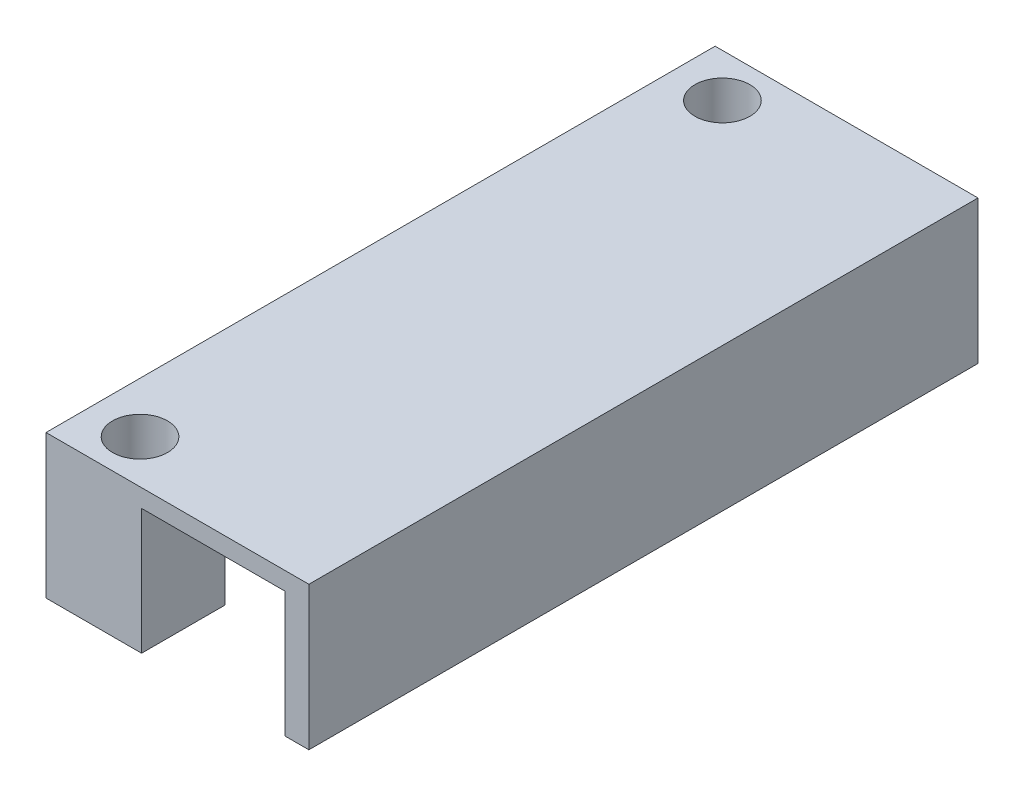
ISO-10303-21;
HEADER;
FILE_DESCRIPTION(('STEP AP214'),'2;1');
FILE_NAME('part.step','',(''),(''),'','','');
FILE_SCHEMA(('AUTOMOTIVE_DESIGN { 1 0 10303 214 1 1 1 1 }'));
ENDSEC;
DATA;
#1=APPLICATION_CONTEXT('core data for automotive mechanical design processes');
#2=APPLICATION_PROTOCOL_DEFINITION('international standard','automotive_design',2000,#1);
#3=PRODUCT_CONTEXT('',#1,'mechanical');
#4=PRODUCT('Part','Part','',(#3));
#5=PRODUCT_RELATED_PRODUCT_CATEGORY('part','',(#4));
#6=PRODUCT_DEFINITION_FORMATION('','',#4);
#7=PRODUCT_DEFINITION_CONTEXT('part definition',#1,'design');
#8=PRODUCT_DEFINITION('design','',#6,#7);
#9=PRODUCT_DEFINITION_SHAPE('','',#8);
#10=(LENGTH_UNIT() NAMED_UNIT(*) SI_UNIT(.MILLI.,.METRE.));
#11=(NAMED_UNIT(*) PLANE_ANGLE_UNIT() SI_UNIT($,.RADIAN.));
#12=(NAMED_UNIT(*) SI_UNIT($,.STERADIAN.) SOLID_ANGLE_UNIT());
#13=UNCERTAINTY_MEASURE_WITH_UNIT(LENGTH_MEASURE(1.E-05),#10,'distance_accuracy_value','');
#14=(GEOMETRIC_REPRESENTATION_CONTEXT(3) GLOBAL_UNCERTAINTY_ASSIGNED_CONTEXT((#13)) GLOBAL_UNIT_ASSIGNED_CONTEXT((#10,
#11,#12)) REPRESENTATION_CONTEXT('',''));
#15=CARTESIAN_POINT('',(0.,0.,0.));
#16=DIRECTION('',(0.,0.,1.));
#17=DIRECTION('',(1.,0.,0.));
#18=AXIS2_PLACEMENT_3D('',#15,#16,#17);
#19=CARTESIAN_POINT('',(0.,0.,0.));
#20=DIRECTION('',(0.,1.,0.));
#21=DIRECTION('',(0.,0.,1.));
#22=AXIS2_PLACEMENT_3D('',#19,#20,#21);
#23=PLANE('',#22);
#24=DIRECTION('',(0.,0.,1.));
#25=VECTOR('',#24,1.);
#26=CARTESIAN_POINT('',(10.,0.,27.));
#27=LINE('',#26,#25);
#28=CARTESIAN_POINT('',(10.,0.,-28.));
#29=VERTEX_POINT('',#28);
#30=CARTESIAN_POINT('',(10.,0.,28.));
#31=VERTEX_POINT('',#30);
#32=EDGE_CURVE('E200',#29,#31,#27,.T.);
#33=ORIENTED_EDGE('',*,*,#32,.F.);
#34=DIRECTION('',(1.,0.,0.));
#35=VECTOR('',#34,1.);
#36=CARTESIAN_POINT('',(0.,0.,-28.));
#37=LINE('',#36,#35);
#38=CARTESIAN_POINT('',(12.,0.,-28.));
#39=VERTEX_POINT('',#38);
#40=EDGE_CURVE('E158',#29,#39,#37,.T.);
#41=ORIENTED_EDGE('',*,*,#40,.T.);
#42=DIRECTION('',(0.,0.,1.));
#43=VECTOR('',#42,1.);
#44=CARTESIAN_POINT('',(12.,0.,0.));
#45=LINE('',#44,#43);
#46=CARTESIAN_POINT('',(12.,0.,28.));
#47=VERTEX_POINT('',#46);
#48=EDGE_CURVE('E245',#39,#47,#45,.T.);
#49=ORIENTED_EDGE('',*,*,#48,.T.);
#50=DIRECTION('',(-1.,0.,0.));
#51=VECTOR('',#50,1.);
#52=CARTESIAN_POINT('',(0.,0.,28.));
#53=LINE('',#52,#51);
#54=EDGE_CURVE('E196',#47,#31,#53,.T.);
#55=ORIENTED_EDGE('',*,*,#54,.T.);
#56=EDGE_LOOP('',(#33,#41,#49,#55));
#57=FACE_BOUND('',#56,.T.);
#58=ADVANCED_FACE('F47',(#57),#23,.F.);
#59=CARTESIAN_POINT('',(-5.76,0.,24.37));
#60=DIRECTION('',(0.,1.,0.));
#61=DIRECTION('',(0.,0.,1.));
#62=AXIS2_PLACEMENT_3D('',#59,#60,#61);
#63=CIRCLE('',#62,2.3);
#64=CARTESIAN_POINT('',(-5.76,0.,26.67));
#65=VERTEX_POINT('',#64);
#66=EDGE_CURVE('E51',#65,#65,#63,.F.);
#67=ORIENTED_EDGE('',*,*,#66,.F.);
#68=EDGE_LOOP('',(#67));
#69=FACE_BOUND('',#68,.T.);
#70=DIRECTION('',(0.,0.,-1.));
#71=VECTOR('',#70,1.);
#72=CARTESIAN_POINT('',(-2.,0.,27.));
#73=LINE('',#72,#71);
#74=CARTESIAN_POINT('',(-2.,0.,28.));
#75=VERTEX_POINT('',#74);
#76=CARTESIAN_POINT('',(-2.,0.,21.));
#77=VERTEX_POINT('',#76);
#78=EDGE_CURVE('E229',#75,#77,#73,.T.);
#79=ORIENTED_EDGE('',*,*,#78,.F.);
#80=CARTESIAN_POINT('',(-10.,0.,28.));
#81=VERTEX_POINT('',#80);
#82=EDGE_CURVE('E201',#75,#81,#53,.T.);
#83=ORIENTED_EDGE('',*,*,#82,.T.);
#84=DIRECTION('',(0.,0.,-1.));
#85=VECTOR('',#84,1.);
#86=CARTESIAN_POINT('',(-10.,0.,0.));
#87=LINE('',#86,#85);
#88=CARTESIAN_POINT('',(-10.,0.,21.));
#89=VERTEX_POINT('',#88);
#90=EDGE_CURVE('E267',#81,#89,#87,.T.);
#91=ORIENTED_EDGE('',*,*,#90,.T.);
#92=DIRECTION('',(-1.,0.,0.));
#93=VECTOR('',#92,1.);
#94=CARTESIAN_POINT('',(-2.,0.,21.));
#95=LINE('',#94,#93);
#96=EDGE_CURVE('E233',#77,#89,#95,.T.);
#97=ORIENTED_EDGE('',*,*,#96,.F.);
#98=EDGE_LOOP('',(#79,#83,#91,#97));
#99=FACE_BOUND('',#98,.T.);
#100=ADVANCED_FACE('F281',(#69,#99),#23,.F.);
#101=CARTESIAN_POINT('',(-5.76,0.,-24.37));
#102=DIRECTION('',(0.,1.,0.));
#103=DIRECTION('',(0.,0.,1.));
#104=AXIS2_PLACEMENT_3D('',#101,#102,#103);
#105=CIRCLE('',#104,2.3);
#106=CARTESIAN_POINT('',(-5.76,0.,-22.07));
#107=VERTEX_POINT('',#106);
#108=EDGE_CURVE('E270',#107,#107,#105,.T.);
#109=ORIENTED_EDGE('',*,*,#108,.T.);
#110=EDGE_LOOP('',(#109));
#111=FACE_BOUND('',#110,.T.);
#112=CARTESIAN_POINT('',(-10.,0.,-28.));
#113=VERTEX_POINT('',#112);
#114=CARTESIAN_POINT('',(-2.,0.,-28.));
#115=VERTEX_POINT('',#114);
#116=EDGE_CURVE('E189',#113,#115,#37,.T.);
#117=ORIENTED_EDGE('',*,*,#116,.T.);
#118=DIRECTION('',(0.,0.,-1.));
#119=VECTOR('',#118,1.);
#120=CARTESIAN_POINT('',(-1.99999999999999,0.,-21.));
#121=LINE('',#120,#119);
#122=CARTESIAN_POINT('',(-1.99999999999999,0.,-21.));
#123=VERTEX_POINT('',#122);
#124=EDGE_CURVE('E73',#123,#115,#121,.T.);
#125=ORIENTED_EDGE('',*,*,#124,.F.);
#126=DIRECTION('',(1.,0.,0.));
#127=VECTOR('',#126,1.);
#128=CARTESIAN_POINT('',(-1.99999999999999,0.,-21.));
#129=LINE('',#128,#127);
#130=CARTESIAN_POINT('',(-9.99999999999999,0.,-21.));
#131=VERTEX_POINT('',#130);
#132=EDGE_CURVE('E236',#131,#123,#129,.T.);
#133=ORIENTED_EDGE('',*,*,#132,.F.);
#134=EDGE_CURVE('E266',#131,#113,#87,.T.);
#135=ORIENTED_EDGE('',*,*,#134,.T.);
#136=EDGE_LOOP('',(#117,#125,#133,#135));
#137=FACE_BOUND('',#136,.T.);
#138=ADVANCED_FACE('F284',(#111,#137),#23,.F.);
#139=CARTESIAN_POINT('',(0.,-22.0227155455452,28.));
#140=DIRECTION('',(0.,0.,1.));
#141=DIRECTION('',(1.,0.,0.));
#142=AXIS2_PLACEMENT_3D('',#139,#140,#141);
#143=PLANE('',#142);
#144=DIRECTION('',(-1.,0.,0.));
#145=VECTOR('',#144,1.);
#146=CARTESIAN_POINT('',(0.,10.5,28.));
#147=LINE('',#146,#145);
#148=CARTESIAN_POINT('',(10.,10.5,28.));
#149=VERTEX_POINT('',#148);
#150=CARTESIAN_POINT('',(-2.,10.5,28.));
#151=VERTEX_POINT('',#150);
#152=EDGE_CURVE('E165',#149,#151,#147,.T.);
#153=ORIENTED_EDGE('',*,*,#152,.F.);
#154=DIRECTION('',(0.,1.,0.));
#155=VECTOR('',#154,1.);
#156=CARTESIAN_POINT('',(10.,-57.2712842531054,28.));
#157=LINE('',#156,#155);
#158=EDGE_CURVE('E174',#31,#149,#157,.T.);
#159=ORIENTED_EDGE('',*,*,#158,.F.);
#160=ORIENTED_EDGE('',*,*,#54,.F.);
#161=DIRECTION('',(0.,1.,0.));
#162=VECTOR('',#161,1.);
#163=CARTESIAN_POINT('',(12.,-22.0227155455452,28.));
#164=LINE('',#163,#162);
#165=CARTESIAN_POINT('',(12.,12.,28.));
#166=VERTEX_POINT('',#165);
#167=EDGE_CURVE('E206',#47,#166,#164,.T.);
#168=ORIENTED_EDGE('',*,*,#167,.T.);
#169=DIRECTION('',(1.,0.,0.));
#170=VECTOR('',#169,1.);
#171=CARTESIAN_POINT('',(0.,12.,28.));
#172=LINE('',#171,#170);
#173=CARTESIAN_POINT('',(-10.,12.,28.));
#174=VERTEX_POINT('',#173);
#175=EDGE_CURVE('E193',#174,#166,#172,.T.);
#176=ORIENTED_EDGE('',*,*,#175,.F.);
#177=DIRECTION('',(0.,1.,0.));
#178=VECTOR('',#177,1.);
#179=CARTESIAN_POINT('',(-10.,-22.0227155455452,28.));
#180=LINE('',#179,#178);
#181=EDGE_CURVE('E205',#81,#174,#180,.T.);
#182=ORIENTED_EDGE('',*,*,#181,.F.);
#183=ORIENTED_EDGE('',*,*,#82,.F.);
#184=DIRECTION('',(0.,1.,0.));
#185=VECTOR('',#184,1.);
#186=CARTESIAN_POINT('',(-2.,-57.2712842531054,28.));
#187=LINE('',#186,#185);
#188=EDGE_CURVE('E168',#75,#151,#187,.T.);
#189=ORIENTED_EDGE('',*,*,#188,.T.);
#190=EDGE_LOOP('',(#153,#159,#160,#168,#176,#182,#183,#189));
#191=FACE_BOUND('',#190,.T.);
#192=ADVANCED_FACE('F293',(#191),#143,.T.);
#193=CARTESIAN_POINT('',(0.,-22.0227155455452,-28.));
#194=DIRECTION('',(0.,0.,-1.));
#195=DIRECTION('',(-1.,0.,0.));
#196=AXIS2_PLACEMENT_3D('',#193,#194,#195);
#197=PLANE('',#196);
#198=ORIENTED_EDGE('',*,*,#40,.F.);
#199=DIRECTION('',(0.,1.,0.));
#200=VECTOR('',#199,1.);
#201=CARTESIAN_POINT('',(10.,-57.2712842531054,-28.));
#202=LINE('',#201,#200);
#203=CARTESIAN_POINT('',(10.,10.5,-28.));
#204=VERTEX_POINT('',#203);
#205=EDGE_CURVE('E159',#29,#204,#202,.T.);
#206=ORIENTED_EDGE('',*,*,#205,.T.);
#207=DIRECTION('',(1.,0.,0.));
#208=VECTOR('',#207,1.);
#209=CARTESIAN_POINT('',(0.,10.5,-28.));
#210=LINE('',#209,#208);
#211=CARTESIAN_POINT('',(-2.,10.5,-28.));
#212=VERTEX_POINT('',#211);
#213=EDGE_CURVE('E145',#212,#204,#210,.T.);
#214=ORIENTED_EDGE('',*,*,#213,.F.);
#215=DIRECTION('',(0.,1.,0.));
#216=VECTOR('',#215,1.);
#217=CARTESIAN_POINT('',(-2.,-57.2712842531054,-28.));
#218=LINE('',#217,#216);
#219=EDGE_CURVE('E152',#115,#212,#218,.T.);
#220=ORIENTED_EDGE('',*,*,#219,.F.);
#221=ORIENTED_EDGE('',*,*,#116,.F.);
#222=DIRECTION('',(0.,1.,0.));
#223=VECTOR('',#222,1.);
#224=CARTESIAN_POINT('',(-10.,-22.0227155455452,-28.));
#225=LINE('',#224,#223);
#226=CARTESIAN_POINT('',(-10.,12.,-28.));
#227=VERTEX_POINT('',#226);
#228=EDGE_CURVE('E180',#113,#227,#225,.T.);
#229=ORIENTED_EDGE('',*,*,#228,.T.);
#230=DIRECTION('',(-1.,0.,0.));
#231=VECTOR('',#230,1.);
#232=CARTESIAN_POINT('',(0.,12.,-28.));
#233=LINE('',#232,#231);
#234=CARTESIAN_POINT('',(12.,12.,-28.));
#235=VERTEX_POINT('',#234);
#236=EDGE_CURVE('E184',#235,#227,#233,.T.);
#237=ORIENTED_EDGE('',*,*,#236,.F.);
#238=DIRECTION('',(0.,1.,0.));
#239=VECTOR('',#238,1.);
#240=CARTESIAN_POINT('',(12.,-22.0227155455452,-28.));
#241=LINE('',#240,#239);
#242=EDGE_CURVE('E185',#39,#235,#241,.T.);
#243=ORIENTED_EDGE('',*,*,#242,.F.);
#244=EDGE_LOOP('',(#198,#206,#214,#220,#221,#229,#237,#243));
#245=FACE_BOUND('',#244,.T.);
#246=ADVANCED_FACE('F162',(#245),#197,.T.);
#247=CARTESIAN_POINT('',(12.,12.,0.));
#248=DIRECTION('',(1.,0.,0.));
#249=DIRECTION('',(0.,0.,-1.));
#250=AXIS2_PLACEMENT_3D('',#247,#248,#249);
#251=PLANE('',#250);
#252=ORIENTED_EDGE('',*,*,#48,.F.);
#253=ORIENTED_EDGE('',*,*,#242,.T.);
#254=DIRECTION('',(0.,0.,1.));
#255=VECTOR('',#254,1.);
#256=CARTESIAN_POINT('',(12.,12.,0.));
#257=LINE('',#256,#255);
#258=EDGE_CURVE('E255',#235,#166,#257,.T.);
#259=ORIENTED_EDGE('',*,*,#258,.T.);
#260=ORIENTED_EDGE('',*,*,#167,.F.);
#261=EDGE_LOOP('',(#252,#253,#259,#260));
#262=FACE_BOUND('',#261,.T.);
#263=ADVANCED_FACE('F49',(#262),#251,.T.);
#264=CARTESIAN_POINT('',(-10.,12.,0.));
#265=DIRECTION('',(-1.,0.,0.));
#266=DIRECTION('',(0.,0.,1.));
#267=AXIS2_PLACEMENT_3D('',#264,#265,#266);
#268=PLANE('',#267);
#269=DIRECTION('',(0.,-1.,0.));
#270=VECTOR('',#269,1.);
#271=CARTESIAN_POINT('',(-9.99999999999999,10.5,-21.));
#272=LINE('',#271,#270);
#273=CARTESIAN_POINT('',(-9.99999999999999,10.5,-21.));
#274=VERTEX_POINT('',#273);
#275=EDGE_CURVE('E246',#274,#131,#272,.T.);
#276=ORIENTED_EDGE('',*,*,#275,.F.);
#277=DIRECTION('',(0.,0.,-1.));
#278=VECTOR('',#277,1.);
#279=CARTESIAN_POINT('',(-10.,10.5,21.));
#280=LINE('',#279,#278);
#281=CARTESIAN_POINT('',(-10.,10.5,21.));
#282=VERTEX_POINT('',#281);
#283=EDGE_CURVE('E222',#282,#274,#280,.T.);
#284=ORIENTED_EDGE('',*,*,#283,.F.);
#285=DIRECTION('',(0.,-1.,0.));
#286=VECTOR('',#285,1.);
#287=CARTESIAN_POINT('',(-10.,10.5,21.));
#288=LINE('',#287,#286);
#289=EDGE_CURVE('E249',#282,#89,#288,.T.);
#290=ORIENTED_EDGE('',*,*,#289,.T.);
#291=ORIENTED_EDGE('',*,*,#90,.F.);
#292=ORIENTED_EDGE('',*,*,#181,.T.);
#293=DIRECTION('',(0.,0.,-1.));
#294=VECTOR('',#293,1.);
#295=CARTESIAN_POINT('',(-10.,12.,0.));
#296=LINE('',#295,#294);
#297=EDGE_CURVE('E258',#174,#227,#296,.T.);
#298=ORIENTED_EDGE('',*,*,#297,.T.);
#299=ORIENTED_EDGE('',*,*,#228,.F.);
#300=ORIENTED_EDGE('',*,*,#134,.F.);
#301=EDGE_LOOP('',(#276,#284,#290,#291,#292,#298,#299,#300));
#302=FACE_BOUND('',#301,.T.);
#303=ADVANCED_FACE('F316',(#302),#268,.T.);
#304=CARTESIAN_POINT('',(-5.76,12.,-24.37));
#305=DIRECTION('',(0.,-1.,0.));
#306=DIRECTION('',(0.,0.,-1.));
#307=AXIS2_PLACEMENT_3D('',#304,#305,#306);
#308=CYLINDRICAL_SURFACE('',#307,2.3);
#309=CARTESIAN_POINT('',(-5.76,12.,-24.37));
#310=DIRECTION('',(0.,1.,0.));
#311=DIRECTION('',(0.,0.,1.));
#312=AXIS2_PLACEMENT_3D('',#309,#310,#311);
#313=CIRCLE('',#312,2.3);
#314=CARTESIAN_POINT('',(-5.76,12.,-22.07));
#315=VERTEX_POINT('',#314);
#316=EDGE_CURVE('E57',#315,#315,#313,.T.);
#317=ORIENTED_EDGE('',*,*,#316,.T.);
#318=EDGE_LOOP('',(#317));
#319=FACE_BOUND('',#318,.T.);
#320=ORIENTED_EDGE('',*,*,#108,.F.);
#321=EDGE_LOOP('',(#320));
#322=FACE_BOUND('',#321,.T.);
#323=ADVANCED_FACE('F373',(#319,#322),#308,.F.);
#324=CARTESIAN_POINT('',(-5.76,12.,24.37));
#325=DIRECTION('',(0.,-1.,0.));
#326=DIRECTION('',(0.,0.,-1.));
#327=AXIS2_PLACEMENT_3D('',#324,#325,#326);
#328=CYLINDRICAL_SURFACE('',#327,2.3);
#329=CARTESIAN_POINT('',(-5.76,12.,24.37));
#330=DIRECTION('',(0.,1.,0.));
#331=DIRECTION('',(0.,0.,1.));
#332=AXIS2_PLACEMENT_3D('',#329,#330,#331);
#333=CIRCLE('',#332,2.3);
#334=CARTESIAN_POINT('',(-5.76,12.,26.67));
#335=VERTEX_POINT('',#334);
#336=EDGE_CURVE('E11',#335,#335,#333,.F.);
#337=ORIENTED_EDGE('',*,*,#336,.F.);
#338=EDGE_LOOP('',(#337));
#339=FACE_BOUND('',#338,.T.);
#340=ORIENTED_EDGE('',*,*,#66,.T.);
#341=EDGE_LOOP('',(#340));
#342=FACE_BOUND('',#341,.T.);
#343=ADVANCED_FACE('F279',(#339,#342),#328,.F.);
#344=CARTESIAN_POINT('',(0.,12.,0.));
#345=DIRECTION('',(0.,1.,0.));
#346=DIRECTION('',(0.,0.,1.));
#347=AXIS2_PLACEMENT_3D('',#344,#345,#346);
#348=PLANE('',#347);
#349=ORIENTED_EDGE('',*,*,#258,.F.);
#350=ORIENTED_EDGE('',*,*,#236,.T.);
#351=ORIENTED_EDGE('',*,*,#297,.F.);
#352=ORIENTED_EDGE('',*,*,#175,.T.);
#353=EDGE_LOOP('',(#349,#350,#351,#352));
#354=FACE_BOUND('',#353,.T.);
#355=ORIENTED_EDGE('',*,*,#316,.F.);
#356=EDGE_LOOP('',(#355));
#357=FACE_BOUND('',#356,.T.);
#358=ORIENTED_EDGE('',*,*,#336,.T.);
#359=EDGE_LOOP('',(#358));
#360=FACE_BOUND('',#359,.T.);
#361=ADVANCED_FACE('F306',(#354,#357,#360),#348,.T.);
#362=CARTESIAN_POINT('',(10.,10.5,27.));
#363=DIRECTION('',(1.,0.,0.));
#364=DIRECTION('',(0.,0.,-1.));
#365=AXIS2_PLACEMENT_3D('',#362,#363,#364);
#366=PLANE('',#365);
#367=ORIENTED_EDGE('',*,*,#32,.T.);
#368=ORIENTED_EDGE('',*,*,#158,.T.);
#369=DIRECTION('',(0.,0.,1.));
#370=VECTOR('',#369,1.);
#371=CARTESIAN_POINT('',(10.,10.5,27.));
#372=LINE('',#371,#370);
#373=EDGE_CURVE('E213',#204,#149,#372,.T.);
#374=ORIENTED_EDGE('',*,*,#373,.F.);
#375=ORIENTED_EDGE('',*,*,#205,.F.);
#376=EDGE_LOOP('',(#367,#368,#374,#375));
#377=FACE_BOUND('',#376,.T.);
#378=ADVANCED_FACE('F310',(#377),#366,.F.);
#379=CARTESIAN_POINT('',(-1.99999999999999,10.5,-21.));
#380=DIRECTION('',(-1.,0.,0.));
#381=DIRECTION('',(0.,0.,1.));
#382=AXIS2_PLACEMENT_3D('',#379,#380,#381);
#383=PLANE('',#382);
#384=ORIENTED_EDGE('',*,*,#124,.T.);
#385=ORIENTED_EDGE('',*,*,#219,.T.);
#386=DIRECTION('',(0.,0.,-1.));
#387=VECTOR('',#386,1.);
#388=CARTESIAN_POINT('',(-1.99999999999999,10.5,-21.));
#389=LINE('',#388,#387);
#390=CARTESIAN_POINT('',(-1.99999999999999,10.5,-21.));
#391=VERTEX_POINT('',#390);
#392=EDGE_CURVE('E142',#391,#212,#389,.T.);
#393=ORIENTED_EDGE('',*,*,#392,.F.);
#394=DIRECTION('',(0.,-1.,0.));
#395=VECTOR('',#394,1.);
#396=CARTESIAN_POINT('',(-1.99999999999999,10.5,-21.));
#397=LINE('',#396,#395);
#398=EDGE_CURVE('E242',#391,#123,#397,.T.);
#399=ORIENTED_EDGE('',*,*,#398,.T.);
#400=EDGE_LOOP('',(#384,#385,#393,#399));
#401=FACE_BOUND('',#400,.T.);
#402=ADVANCED_FACE('F153',(#401),#383,.F.);
#403=CARTESIAN_POINT('',(-1.99999999999999,10.5,-21.));
#404=DIRECTION('',(0.,0.,-1.));
#405=DIRECTION('',(-1.,0.,0.));
#406=AXIS2_PLACEMENT_3D('',#403,#404,#405);
#407=PLANE('',#406);
#408=ORIENTED_EDGE('',*,*,#132,.T.);
#409=ORIENTED_EDGE('',*,*,#398,.F.);
#410=DIRECTION('',(1.,0.,0.));
#411=VECTOR('',#410,1.);
#412=CARTESIAN_POINT('',(-1.99999999999999,10.5,-21.));
#413=LINE('',#412,#411);
#414=EDGE_CURVE('E148',#274,#391,#413,.T.);
#415=ORIENTED_EDGE('',*,*,#414,.F.);
#416=ORIENTED_EDGE('',*,*,#275,.T.);
#417=EDGE_LOOP('',(#408,#409,#415,#416));
#418=FACE_BOUND('',#417,.T.);
#419=ADVANCED_FACE('F320',(#418),#407,.F.);
#420=CARTESIAN_POINT('',(-2.,10.5,21.));
#421=DIRECTION('',(0.,0.,1.));
#422=DIRECTION('',(1.,0.,0.));
#423=AXIS2_PLACEMENT_3D('',#420,#421,#422);
#424=PLANE('',#423);
#425=ORIENTED_EDGE('',*,*,#96,.T.);
#426=ORIENTED_EDGE('',*,*,#289,.F.);
#427=DIRECTION('',(-1.,0.,0.));
#428=VECTOR('',#427,1.);
#429=CARTESIAN_POINT('',(-2.,10.5,21.));
#430=LINE('',#429,#428);
#431=CARTESIAN_POINT('',(-2.,10.5,21.));
#432=VERTEX_POINT('',#431);
#433=EDGE_CURVE('E218',#432,#282,#430,.T.);
#434=ORIENTED_EDGE('',*,*,#433,.F.);
#435=DIRECTION('',(0.,-1.,0.));
#436=VECTOR('',#435,1.);
#437=CARTESIAN_POINT('',(-2.,10.5,21.));
#438=LINE('',#437,#436);
#439=EDGE_CURVE('E150',#432,#77,#438,.T.);
#440=ORIENTED_EDGE('',*,*,#439,.T.);
#441=EDGE_LOOP('',(#425,#426,#434,#440));
#442=FACE_BOUND('',#441,.T.);
#443=ADVANCED_FACE('F421',(#442),#424,.F.);
#444=CARTESIAN_POINT('',(-2.,10.5,27.));
#445=DIRECTION('',(-1.,0.,0.));
#446=DIRECTION('',(0.,0.,1.));
#447=AXIS2_PLACEMENT_3D('',#444,#445,#446);
#448=PLANE('',#447);
#449=ORIENTED_EDGE('',*,*,#78,.T.);
#450=ORIENTED_EDGE('',*,*,#439,.F.);
#451=DIRECTION('',(0.,0.,-1.));
#452=VECTOR('',#451,1.);
#453=CARTESIAN_POINT('',(-2.,10.5,27.));
#454=LINE('',#453,#452);
#455=EDGE_CURVE('E65',#151,#432,#454,.T.);
#456=ORIENTED_EDGE('',*,*,#455,.F.);
#457=ORIENTED_EDGE('',*,*,#188,.F.);
#458=EDGE_LOOP('',(#449,#450,#456,#457));
#459=FACE_BOUND('',#458,.T.);
#460=ADVANCED_FACE('F289',(#459),#448,.F.);
#461=CARTESIAN_POINT('',(0.,10.5,0.));
#462=DIRECTION('',(0.,1.,0.));
#463=DIRECTION('',(0.,0.,1.));
#464=AXIS2_PLACEMENT_3D('',#461,#462,#463);
#465=PLANE('',#464);
#466=ORIENTED_EDGE('',*,*,#455,.T.);
#467=ORIENTED_EDGE('',*,*,#433,.T.);
#468=ORIENTED_EDGE('',*,*,#283,.T.);
#469=ORIENTED_EDGE('',*,*,#414,.T.);
#470=ORIENTED_EDGE('',*,*,#392,.T.);
#471=ORIENTED_EDGE('',*,*,#213,.T.);
#472=ORIENTED_EDGE('',*,*,#373,.T.);
#473=ORIENTED_EDGE('',*,*,#152,.T.);
#474=EDGE_LOOP('',(#466,#467,#468,#469,#470,#471,#472,#473));
#475=FACE_BOUND('',#474,.T.);
#476=ADVANCED_FACE('F143',(#475),#465,.F.);
#477=CLOSED_SHELL('',(#58,#100,#138,#192,#246,#263,#303,#323,#343,#361,#378,#402,#419,#443,#460,#476));
#478=MANIFOLD_SOLID_BREP('B2',#477);
#479=ADVANCED_BREP_SHAPE_REPRESENTATION('',(#18,#478),#14);
#480=SHAPE_DEFINITION_REPRESENTATION(#9,#479);
ENDSEC;
END-ISO-10303-21;
